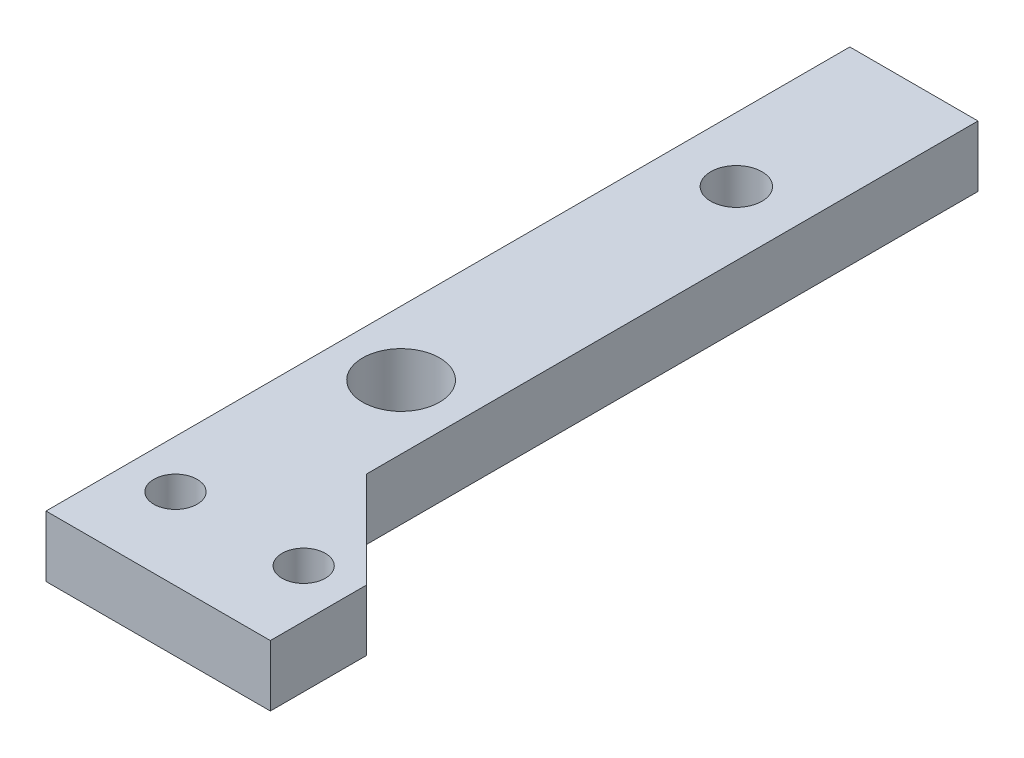
ISO-10303-21;
HEADER;
FILE_DESCRIPTION(('STEP AP214'),'2;1');
FILE_NAME('part.step','',(''),(''),'','','');
FILE_SCHEMA(('AUTOMOTIVE_DESIGN { 1 0 10303 214 1 1 1 1 }'));
ENDSEC;
DATA;
#1=APPLICATION_CONTEXT('core data for automotive mechanical design processes');
#2=APPLICATION_PROTOCOL_DEFINITION('international standard','automotive_design',2000,#1);
#3=PRODUCT_CONTEXT('',#1,'mechanical');
#4=PRODUCT('Part','Part','',(#3));
#5=PRODUCT_RELATED_PRODUCT_CATEGORY('part','',(#4));
#6=PRODUCT_DEFINITION_FORMATION('','',#4);
#7=PRODUCT_DEFINITION_CONTEXT('part definition',#1,'design');
#8=PRODUCT_DEFINITION('design','',#6,#7);
#9=PRODUCT_DEFINITION_SHAPE('','',#8);
#10=(LENGTH_UNIT() NAMED_UNIT(*) SI_UNIT(.MILLI.,.METRE.));
#11=(NAMED_UNIT(*) PLANE_ANGLE_UNIT() SI_UNIT($,.RADIAN.));
#12=(NAMED_UNIT(*) SI_UNIT($,.STERADIAN.) SOLID_ANGLE_UNIT());
#13=UNCERTAINTY_MEASURE_WITH_UNIT(LENGTH_MEASURE(1.E-05),#10,'distance_accuracy_value','');
#14=(GEOMETRIC_REPRESENTATION_CONTEXT(3) GLOBAL_UNCERTAINTY_ASSIGNED_CONTEXT((#13)) GLOBAL_UNIT_ASSIGNED_CONTEXT((#10,
#11,#12)) REPRESENTATION_CONTEXT('',''));
#15=CARTESIAN_POINT('',(0.,0.,0.));
#16=DIRECTION('',(0.,0.,1.));
#17=DIRECTION('',(1.,0.,0.));
#18=AXIS2_PLACEMENT_3D('',#15,#16,#17);
#19=CARTESIAN_POINT('',(20.,9.525,0.));
#20=DIRECTION('',(-1.,0.,0.));
#21=DIRECTION('',(0.,0.,1.));
#22=AXIS2_PLACEMENT_3D('',#19,#20,#21);
#23=PLANE('',#22);
#24=DIRECTION('',(0.,1.,0.));
#25=VECTOR('',#24,1.);
#26=CARTESIAN_POINT('',(20.,-33.541019662497,95.3999999999999));
#27=LINE('',#26,#25);
#28=CARTESIAN_POINT('',(20.,0.,95.3999999999999));
#29=VERTEX_POINT('',#28);
#30=CARTESIAN_POINT('',(20.,9.525,95.3999999999999));
#31=VERTEX_POINT('',#30);
#32=EDGE_CURVE('E60',#29,#31,#27,.T.);
#33=ORIENTED_EDGE('',*,*,#32,.F.);
#34=DIRECTION('',(0.,0.,-1.));
#35=VECTOR('',#34,1.);
#36=CARTESIAN_POINT('',(20.,0.,0.));
#37=LINE('',#36,#35);
#38=CARTESIAN_POINT('',(20.,0.,0.));
#39=VERTEX_POINT('',#38);
#40=EDGE_CURVE('E88',#29,#39,#37,.T.);
#41=ORIENTED_EDGE('',*,*,#40,.T.);
#42=DIRECTION('',(0.,-1.,0.));
#43=VECTOR('',#42,1.);
#44=CARTESIAN_POINT('',(20.,9.525,0.));
#45=LINE('',#44,#43);
#46=CARTESIAN_POINT('',(20.,9.525,0.));
#47=VERTEX_POINT('',#46);
#48=EDGE_CURVE('E11',#47,#39,#45,.T.);
#49=ORIENTED_EDGE('',*,*,#48,.F.);
#50=DIRECTION('',(0.,0.,-1.));
#51=VECTOR('',#50,1.);
#52=CARTESIAN_POINT('',(20.,9.525,0.));
#53=LINE('',#52,#51);
#54=EDGE_CURVE('E109',#31,#47,#53,.T.);
#55=ORIENTED_EDGE('',*,*,#54,.F.);
#56=EDGE_LOOP('',(#33,#41,#49,#55));
#57=FACE_BOUND('',#56,.T.);
#58=ADVANCED_FACE('F45',(#57),#23,.F.);
#59=CARTESIAN_POINT('',(0.,9.525,0.));
#60=DIRECTION('',(0.,1.,0.));
#61=DIRECTION('',(0.,0.,1.));
#62=AXIS2_PLACEMENT_3D('',#59,#60,#61);
#63=PLANE('',#62);
#64=CARTESIAN_POINT('',(7.5,9.525,112.7));
#65=DIRECTION('',(0.,1.,0.));
#66=DIRECTION('',(0.,0.,1.));
#67=AXIS2_PLACEMENT_3D('',#64,#65,#66);
#68=CIRCLE('',#67,3.37819999999999);
#69=CARTESIAN_POINT('',(7.5,9.525,116.0782));
#70=VERTEX_POINT('',#69);
#71=EDGE_CURVE('E153',#70,#70,#68,.T.);
#72=ORIENTED_EDGE('',*,*,#71,.F.);
#73=EDGE_LOOP('',(#72));
#74=FACE_BOUND('',#73,.T.);
#75=CARTESIAN_POINT('',(27.5,9.525,112.7));
#76=DIRECTION('',(0.,1.,0.));
#77=DIRECTION('',(0.,0.,1.));
#78=AXIS2_PLACEMENT_3D('',#75,#76,#77);
#79=CIRCLE('',#78,3.37819999999999);
#80=CARTESIAN_POINT('',(27.5,9.525,116.0782));
#81=VERTEX_POINT('',#80);
#82=EDGE_CURVE('E147',#81,#81,#79,.T.);
#83=ORIENTED_EDGE('',*,*,#82,.F.);
#84=EDGE_LOOP('',(#83));
#85=FACE_BOUND('',#84,.T.);
#86=CARTESIAN_POINT('',(10.,9.525,80.));
#87=DIRECTION('',(0.,1.,0.));
#88=DIRECTION('',(0.,0.,1.));
#89=AXIS2_PLACEMENT_3D('',#86,#87,#88);
#90=CIRCLE('',#89,6.00000000000001);
#91=CARTESIAN_POINT('',(10.,9.525,74.));
#92=VERTEX_POINT('',#91);
#93=EDGE_CURVE('E101',#92,#92,#90,.T.);
#94=ORIENTED_EDGE('',*,*,#93,.F.);
#95=EDGE_LOOP('',(#94));
#96=FACE_BOUND('',#95,.T.);
#97=DIRECTION('',(0.,0.,1.));
#98=VECTOR('',#97,1.);
#99=CARTESIAN_POINT('',(0.,9.525,0.));
#100=LINE('',#99,#98);
#101=CARTESIAN_POINT('',(0.,9.525,0.));
#102=VERTEX_POINT('',#101);
#103=CARTESIAN_POINT('',(0.,9.525,125.4));
#104=VERTEX_POINT('',#103);
#105=EDGE_CURVE('E87',#102,#104,#100,.T.);
#106=ORIENTED_EDGE('',*,*,#105,.T.);
#107=DIRECTION('',(1.,0.,0.));
#108=VECTOR('',#107,1.);
#109=CARTESIAN_POINT('',(0.,9.525,125.4));
#110=LINE('',#109,#108);
#111=CARTESIAN_POINT('',(35.,9.525,125.4));
#112=VERTEX_POINT('',#111);
#113=EDGE_CURVE('E123',#104,#112,#110,.T.);
#114=ORIENTED_EDGE('',*,*,#113,.T.);
#115=DIRECTION('',(0.,0.,-1.));
#116=VECTOR('',#115,1.);
#117=CARTESIAN_POINT('',(35.,9.525,125.4));
#118=LINE('',#117,#116);
#119=CARTESIAN_POINT('',(35.,9.525,110.4));
#120=VERTEX_POINT('',#119);
#121=EDGE_CURVE('E138',#112,#120,#118,.T.);
#122=ORIENTED_EDGE('',*,*,#121,.T.);
#123=DIRECTION('',(-0.707106781186544,0.,-0.707106781186551));
#124=VECTOR('',#123,1.);
#125=CARTESIAN_POINT('',(35.,9.525,110.4));
#126=LINE('',#125,#124);
#127=EDGE_CURVE('E131',#120,#31,#126,.T.);
#128=ORIENTED_EDGE('',*,*,#127,.T.);
#129=ORIENTED_EDGE('',*,*,#54,.T.);
#130=DIRECTION('',(-1.,0.,0.));
#131=VECTOR('',#130,1.);
#132=CARTESIAN_POINT('',(0.,9.525,0.));
#133=LINE('',#132,#131);
#134=EDGE_CURVE('E69',#47,#102,#133,.T.);
#135=ORIENTED_EDGE('',*,*,#134,.T.);
#136=EDGE_LOOP('',(#106,#114,#122,#128,#129,#135));
#137=FACE_BOUND('',#136,.T.);
#138=CARTESIAN_POINT('',(10.,9.525,27.7));
#139=DIRECTION('',(0.,1.,0.));
#140=DIRECTION('',(0.,0.,1.));
#141=AXIS2_PLACEMENT_3D('',#138,#139,#140);
#142=CIRCLE('',#141,4.);
#143=CARTESIAN_POINT('',(10.,9.525,23.7));
#144=VERTEX_POINT('',#143);
#145=EDGE_CURVE('E113',#144,#144,#142,.T.);
#146=ORIENTED_EDGE('',*,*,#145,.F.);
#147=EDGE_LOOP('',(#146));
#148=FACE_BOUND('',#147,.T.);
#149=ADVANCED_FACE('F159',(#74,#85,#96,#137,#148),#63,.T.);
#150=CARTESIAN_POINT('',(0.,0.,0.));
#151=DIRECTION('',(0.,1.,0.));
#152=DIRECTION('',(0.,0.,1.));
#153=AXIS2_PLACEMENT_3D('',#150,#151,#152);
#154=PLANE('',#153);
#155=CARTESIAN_POINT('',(7.5,0.,112.7));
#156=DIRECTION('',(0.,1.,0.));
#157=DIRECTION('',(0.,0.,1.));
#158=AXIS2_PLACEMENT_3D('',#155,#156,#157);
#159=CIRCLE('',#158,3.3782);
#160=CARTESIAN_POINT('',(7.5,0.,116.0782));
#161=VERTEX_POINT('',#160);
#162=EDGE_CURVE('E150',#161,#161,#159,.T.);
#163=ORIENTED_EDGE('',*,*,#162,.T.);
#164=EDGE_LOOP('',(#163));
#165=FACE_BOUND('',#164,.T.);
#166=CARTESIAN_POINT('',(27.5,0.,112.7));
#167=DIRECTION('',(0.,1.,0.));
#168=DIRECTION('',(0.,0.,1.));
#169=AXIS2_PLACEMENT_3D('',#166,#167,#168);
#170=CIRCLE('',#169,3.3782);
#171=CARTESIAN_POINT('',(27.5,0.,116.0782));
#172=VERTEX_POINT('',#171);
#173=EDGE_CURVE('E141',#172,#172,#170,.T.);
#174=ORIENTED_EDGE('',*,*,#173,.T.);
#175=EDGE_LOOP('',(#174));
#176=FACE_BOUND('',#175,.T.);
#177=DIRECTION('',(0.,0.,1.));
#178=VECTOR('',#177,1.);
#179=CARTESIAN_POINT('',(0.,0.,0.));
#180=LINE('',#179,#178);
#181=CARTESIAN_POINT('',(0.,0.,0.));
#182=VERTEX_POINT('',#181);
#183=CARTESIAN_POINT('',(0.,0.,125.4));
#184=VERTEX_POINT('',#183);
#185=EDGE_CURVE('E93',#182,#184,#180,.T.);
#186=ORIENTED_EDGE('',*,*,#185,.F.);
#187=DIRECTION('',(-1.,0.,0.));
#188=VECTOR('',#187,1.);
#189=CARTESIAN_POINT('',(0.,0.,0.));
#190=LINE('',#189,#188);
#191=EDGE_CURVE('E80',#39,#182,#190,.T.);
#192=ORIENTED_EDGE('',*,*,#191,.F.);
#193=ORIENTED_EDGE('',*,*,#40,.F.);
#194=DIRECTION('',(0.707106781186544,0.,0.707106781186551));
#195=VECTOR('',#194,1.);
#196=CARTESIAN_POINT('',(35.,0.,110.4));
#197=LINE('',#196,#195);
#198=CARTESIAN_POINT('',(35.,0.,110.4));
#199=VERTEX_POINT('',#198);
#200=EDGE_CURVE('E126',#29,#199,#197,.T.);
#201=ORIENTED_EDGE('',*,*,#200,.T.);
#202=DIRECTION('',(0.,0.,1.));
#203=VECTOR('',#202,1.);
#204=CARTESIAN_POINT('',(35.,0.,125.4));
#205=LINE('',#204,#203);
#206=CARTESIAN_POINT('',(35.,0.,125.4));
#207=VERTEX_POINT('',#206);
#208=EDGE_CURVE('E135',#199,#207,#205,.T.);
#209=ORIENTED_EDGE('',*,*,#208,.T.);
#210=DIRECTION('',(-1.,0.,0.));
#211=VECTOR('',#210,1.);
#212=CARTESIAN_POINT('',(0.,0.,125.4));
#213=LINE('',#212,#211);
#214=EDGE_CURVE('E99',#207,#184,#213,.T.);
#215=ORIENTED_EDGE('',*,*,#214,.T.);
#216=EDGE_LOOP('',(#186,#192,#193,#201,#209,#215));
#217=FACE_BOUND('',#216,.T.);
#218=CARTESIAN_POINT('',(10.,0.,80.));
#219=DIRECTION('',(0.,1.,0.));
#220=DIRECTION('',(0.,0.,1.));
#221=AXIS2_PLACEMENT_3D('',#218,#219,#220);
#222=CIRCLE('',#221,6.00000000000001);
#223=CARTESIAN_POINT('',(10.,0.,74.));
#224=VERTEX_POINT('',#223);
#225=EDGE_CURVE('E105',#224,#224,#222,.T.);
#226=ORIENTED_EDGE('',*,*,#225,.T.);
#227=EDGE_LOOP('',(#226));
#228=FACE_BOUND('',#227,.T.);
#229=CARTESIAN_POINT('',(10.,0.,27.7));
#230=DIRECTION('',(0.,1.,0.));
#231=DIRECTION('',(0.,0.,1.));
#232=AXIS2_PLACEMENT_3D('',#229,#230,#231);
#233=CIRCLE('',#232,4.);
#234=CARTESIAN_POINT('',(10.,0.,23.7));
#235=VERTEX_POINT('',#234);
#236=EDGE_CURVE('E115',#235,#235,#233,.T.);
#237=ORIENTED_EDGE('',*,*,#236,.T.);
#238=EDGE_LOOP('',(#237));
#239=FACE_BOUND('',#238,.T.);
#240=ADVANCED_FACE('F95',(#165,#176,#217,#228,#239),#154,.F.);
#241=CARTESIAN_POINT('',(0.,9.525,0.));
#242=DIRECTION('',(1.,0.,0.));
#243=DIRECTION('',(0.,0.,-1.));
#244=AXIS2_PLACEMENT_3D('',#241,#242,#243);
#245=PLANE('',#244);
#246=ORIENTED_EDGE('',*,*,#185,.T.);
#247=DIRECTION('',(0.,1.,0.));
#248=VECTOR('',#247,1.);
#249=CARTESIAN_POINT('',(0.,-32.3289344086687,125.4));
#250=LINE('',#249,#248);
#251=EDGE_CURVE('E121',#184,#104,#250,.T.);
#252=ORIENTED_EDGE('',*,*,#251,.T.);
#253=ORIENTED_EDGE('',*,*,#105,.F.);
#254=DIRECTION('',(0.,-1.,0.));
#255=VECTOR('',#254,1.);
#256=CARTESIAN_POINT('',(0.,9.525,0.));
#257=LINE('',#256,#255);
#258=EDGE_CURVE('E53',#102,#182,#257,.T.);
#259=ORIENTED_EDGE('',*,*,#258,.T.);
#260=EDGE_LOOP('',(#246,#252,#253,#259));
#261=FACE_BOUND('',#260,.T.);
#262=ADVANCED_FACE('F47',(#261),#245,.F.);
#263=CARTESIAN_POINT('',(0.,9.525,0.));
#264=DIRECTION('',(0.,0.,1.));
#265=DIRECTION('',(1.,0.,0.));
#266=AXIS2_PLACEMENT_3D('',#263,#264,#265);
#267=PLANE('',#266);
#268=ORIENTED_EDGE('',*,*,#191,.T.);
#269=ORIENTED_EDGE('',*,*,#258,.F.);
#270=ORIENTED_EDGE('',*,*,#134,.F.);
#271=ORIENTED_EDGE('',*,*,#48,.T.);
#272=EDGE_LOOP('',(#268,#269,#270,#271));
#273=FACE_BOUND('',#272,.T.);
#274=ADVANCED_FACE('F82',(#273),#267,.F.);
#275=CARTESIAN_POINT('',(10.,9.525,80.));
#276=DIRECTION('',(0.,-1.,0.));
#277=DIRECTION('',(0.,0.,-1.));
#278=AXIS2_PLACEMENT_3D('',#275,#276,#277);
#279=CYLINDRICAL_SURFACE('',#278,6.00000000000001);
#280=CARTESIAN_POINT('',(10.,9.525,74.));
#281=CARTESIAN_POINT('',(10.,9.42578125,74.));
#282=CARTESIAN_POINT('',(10.,9.3265625,74.));
#283=CARTESIAN_POINT('',(10.,9.128125,74.));
#284=CARTESIAN_POINT('',(10.,9.02890625,74.));
#285=CARTESIAN_POINT('',(10.,8.83046875,74.));
#286=CARTESIAN_POINT('',(10.,8.73125,74.));
#287=CARTESIAN_POINT('',(10.,8.5328125,74.));
#288=CARTESIAN_POINT('',(10.,8.43359375,74.));
#289=CARTESIAN_POINT('',(10.,8.23515625,74.));
#290=CARTESIAN_POINT('',(10.,8.1359375,74.));
#291=CARTESIAN_POINT('',(10.,7.9375,74.));
#292=CARTESIAN_POINT('',(10.,7.83828125,74.));
#293=CARTESIAN_POINT('',(10.,7.63984375,74.));
#294=CARTESIAN_POINT('',(10.,7.540625,74.));
#295=CARTESIAN_POINT('',(10.,7.3421875,74.));
#296=CARTESIAN_POINT('',(10.,7.24296875,74.));
#297=CARTESIAN_POINT('',(10.,7.04453125,74.));
#298=CARTESIAN_POINT('',(10.,6.9453125,74.));
#299=CARTESIAN_POINT('',(10.,6.746875,74.));
#300=CARTESIAN_POINT('',(10.,6.64765625,74.));
#301=CARTESIAN_POINT('',(10.,6.44921875,74.));
#302=CARTESIAN_POINT('',(10.,6.35,74.));
#303=CARTESIAN_POINT('',(10.,6.1515625,74.));
#304=CARTESIAN_POINT('',(10.,6.05234375,74.));
#305=CARTESIAN_POINT('',(10.,5.85390625,74.));
#306=CARTESIAN_POINT('',(10.,5.7546875,74.));
#307=CARTESIAN_POINT('',(10.,5.55625,74.));
#308=CARTESIAN_POINT('',(10.,5.45703125,74.));
#309=CARTESIAN_POINT('',(10.,5.25859375,74.));
#310=CARTESIAN_POINT('',(10.,5.159375,74.));
#311=CARTESIAN_POINT('',(10.,4.9609375,74.));
#312=CARTESIAN_POINT('',(10.,4.86171875,74.));
#313=CARTESIAN_POINT('',(10.,4.66328125,74.));
#314=CARTESIAN_POINT('',(10.,4.5640625,74.));
#315=CARTESIAN_POINT('',(10.,4.365625,74.));
#316=CARTESIAN_POINT('',(10.,4.26640625,74.));
#317=CARTESIAN_POINT('',(10.,4.06796875,74.));
#318=CARTESIAN_POINT('',(10.,3.96875,74.));
#319=CARTESIAN_POINT('',(10.,3.7703125,74.));
#320=CARTESIAN_POINT('',(10.,3.67109375,74.));
#321=CARTESIAN_POINT('',(10.,3.47265625,74.));
#322=CARTESIAN_POINT('',(10.,3.3734375,74.));
#323=CARTESIAN_POINT('',(10.,3.175,74.));
#324=CARTESIAN_POINT('',(10.,3.07578125,74.));
#325=CARTESIAN_POINT('',(10.,2.87734375,74.));
#326=CARTESIAN_POINT('',(10.,2.778125,74.));
#327=CARTESIAN_POINT('',(10.,2.5796875,74.));
#328=CARTESIAN_POINT('',(10.,2.48046875,74.));
#329=CARTESIAN_POINT('',(10.,2.28203125,74.));
#330=CARTESIAN_POINT('',(10.,2.1828125,74.));
#331=CARTESIAN_POINT('',(10.,1.984375,74.));
#332=CARTESIAN_POINT('',(10.,1.88515625,74.));
#333=CARTESIAN_POINT('',(10.,1.68671875,74.));
#334=CARTESIAN_POINT('',(10.,1.5875,74.));
#335=CARTESIAN_POINT('',(10.,1.3890625,74.));
#336=CARTESIAN_POINT('',(10.,1.28984375,74.));
#337=CARTESIAN_POINT('',(10.,1.09140625,74.));
#338=CARTESIAN_POINT('',(10.,0.992187500000001,74.));
#339=CARTESIAN_POINT('',(10.,0.793750000000001,74.));
#340=CARTESIAN_POINT('',(10.,0.69453125,74.));
#341=CARTESIAN_POINT('',(10.,0.49609375,74.));
#342=CARTESIAN_POINT('',(10.,0.396875,74.));
#343=CARTESIAN_POINT('',(10.,0.1984375,74.));
#344=CARTESIAN_POINT('',(10.,0.0992187500000001,74.));
#345=CARTESIAN_POINT('',(10.,0.,74.));
#346=B_SPLINE_CURVE_WITH_KNOTS('',3,(#280,#281,#282,#283,#284,#285,#286,#287,#288,#289,#290,
#291,#292,#293,#294,#295,#296,#297,#298,#299,#300,#301,#302,#303,#304,#305,#306,#307,#308,#309,
#310,#311,#312,#313,#314,#315,#316,#317,#318,#319,#320,#321,#322,#323,#324,#325,#326,#327,#328,
#329,#330,#331,#332,#333,#334,#335,#336,#337,#338,#339,#340,#341,#342,#343,#344,#345),
.UNSPECIFIED.,.F.,.F.,(4,2,2,2,2,2,2,2,2,2,2,2,2,2,2,2,2,2,2,2,2,2,2,2,2,2,2,2,2,2,2,2,4),(0.,
0.29765625,0.5953125,0.892968750000001,1.190625,1.48828125,1.7859375,2.08359375,2.38125,
2.67890625,2.9765625,3.27421875,3.571875,3.86953125,4.1671875,4.46484375,4.7625,5.06015625,
5.3578125,5.65546875,5.953125,6.25078125,6.5484375,6.84609375,7.14375,7.44140625,7.7390625,
8.03671875,8.334375,8.63203125,8.9296875,9.22734375,9.525),.UNSPECIFIED.);
#347=EDGE_CURVE('BSEAM174',#92,#224,#346,.T.);
#348=ORIENTED_EDGE('',*,*,#93,.T.);
#349=ORIENTED_EDGE('',*,*,#225,.F.);
#350=ORIENTED_EDGE('',*,*,#347,.T.);
#351=ORIENTED_EDGE('',*,*,#347,.F.);
#352=EDGE_LOOP('',(#348,#350,#349,#351));
#353=FACE_BOUND('',#352,.T.);
#354=ADVANCED_FACE('F174',(#353),#279,.F.);
#355=CARTESIAN_POINT('',(10.,9.525,27.7));
#356=DIRECTION('',(0.,-1.,0.));
#357=DIRECTION('',(0.,0.,-1.));
#358=AXIS2_PLACEMENT_3D('',#355,#356,#357);
#359=CYLINDRICAL_SURFACE('',#358,4.);
#360=CARTESIAN_POINT('',(10.,9.525,23.7));
#361=CARTESIAN_POINT('',(10.,9.42578125,23.7));
#362=CARTESIAN_POINT('',(10.,9.3265625,23.7));
#363=CARTESIAN_POINT('',(10.,9.128125,23.7));
#364=CARTESIAN_POINT('',(10.,9.02890625,23.7));
#365=CARTESIAN_POINT('',(10.,8.83046875,23.7));
#366=CARTESIAN_POINT('',(10.,8.73125,23.7));
#367=CARTESIAN_POINT('',(10.,8.5328125,23.7));
#368=CARTESIAN_POINT('',(10.,8.43359375,23.7));
#369=CARTESIAN_POINT('',(10.,8.23515625,23.7));
#370=CARTESIAN_POINT('',(10.,8.1359375,23.7));
#371=CARTESIAN_POINT('',(10.,7.9375,23.7));
#372=CARTESIAN_POINT('',(10.,7.83828125,23.7));
#373=CARTESIAN_POINT('',(10.,7.63984375,23.7));
#374=CARTESIAN_POINT('',(10.,7.540625,23.7));
#375=CARTESIAN_POINT('',(10.,7.3421875,23.7));
#376=CARTESIAN_POINT('',(10.,7.24296875,23.7));
#377=CARTESIAN_POINT('',(10.,7.04453125,23.7));
#378=CARTESIAN_POINT('',(10.,6.9453125,23.7));
#379=CARTESIAN_POINT('',(10.,6.746875,23.7));
#380=CARTESIAN_POINT('',(10.,6.64765625,23.7));
#381=CARTESIAN_POINT('',(10.,6.44921875,23.7));
#382=CARTESIAN_POINT('',(10.,6.35,23.7));
#383=CARTESIAN_POINT('',(10.,6.1515625,23.7));
#384=CARTESIAN_POINT('',(10.,6.05234375,23.7));
#385=CARTESIAN_POINT('',(10.,5.85390625,23.7));
#386=CARTESIAN_POINT('',(10.,5.7546875,23.7));
#387=CARTESIAN_POINT('',(10.,5.55625,23.7));
#388=CARTESIAN_POINT('',(10.,5.45703125,23.7));
#389=CARTESIAN_POINT('',(10.,5.25859375,23.7));
#390=CARTESIAN_POINT('',(10.,5.159375,23.7));
#391=CARTESIAN_POINT('',(10.,4.9609375,23.7));
#392=CARTESIAN_POINT('',(10.,4.86171875,23.7));
#393=CARTESIAN_POINT('',(10.,4.66328125,23.7));
#394=CARTESIAN_POINT('',(10.,4.5640625,23.7));
#395=CARTESIAN_POINT('',(10.,4.365625,23.7));
#396=CARTESIAN_POINT('',(10.,4.26640625,23.7));
#397=CARTESIAN_POINT('',(10.,4.06796875,23.7));
#398=CARTESIAN_POINT('',(10.,3.96875,23.7));
#399=CARTESIAN_POINT('',(10.,3.7703125,23.7));
#400=CARTESIAN_POINT('',(10.,3.67109375,23.7));
#401=CARTESIAN_POINT('',(10.,3.47265625,23.7));
#402=CARTESIAN_POINT('',(10.,3.3734375,23.7));
#403=CARTESIAN_POINT('',(10.,3.175,23.7));
#404=CARTESIAN_POINT('',(10.,3.07578125,23.7));
#405=CARTESIAN_POINT('',(10.,2.87734375,23.7));
#406=CARTESIAN_POINT('',(10.,2.778125,23.7));
#407=CARTESIAN_POINT('',(10.,2.5796875,23.7));
#408=CARTESIAN_POINT('',(10.,2.48046875,23.7));
#409=CARTESIAN_POINT('',(10.,2.28203125,23.7));
#410=CARTESIAN_POINT('',(10.,2.1828125,23.7));
#411=CARTESIAN_POINT('',(10.,1.984375,23.7));
#412=CARTESIAN_POINT('',(10.,1.88515625,23.7));
#413=CARTESIAN_POINT('',(10.,1.68671875,23.7));
#414=CARTESIAN_POINT('',(10.,1.5875,23.7));
#415=CARTESIAN_POINT('',(10.,1.3890625,23.7));
#416=CARTESIAN_POINT('',(10.,1.28984375,23.7));
#417=CARTESIAN_POINT('',(10.,1.09140625,23.7));
#418=CARTESIAN_POINT('',(10.,0.992187500000001,23.7));
#419=CARTESIAN_POINT('',(10.,0.793750000000001,23.7));
#420=CARTESIAN_POINT('',(10.,0.69453125,23.7));
#421=CARTESIAN_POINT('',(10.,0.49609375,23.7));
#422=CARTESIAN_POINT('',(10.,0.396875,23.7));
#423=CARTESIAN_POINT('',(10.,0.1984375,23.7));
#424=CARTESIAN_POINT('',(10.,0.0992187500000001,23.7));
#425=CARTESIAN_POINT('',(10.,0.,23.7));
#426=B_SPLINE_CURVE_WITH_KNOTS('',3,(#360,#361,#362,#363,#364,#365,#366,#367,#368,#369,#370,
#371,#372,#373,#374,#375,#376,#377,#378,#379,#380,#381,#382,#383,#384,#385,#386,#387,#388,#389,
#390,#391,#392,#393,#394,#395,#396,#397,#398,#399,#400,#401,#402,#403,#404,#405,#406,#407,#408,
#409,#410,#411,#412,#413,#414,#415,#416,#417,#418,#419,#420,#421,#422,#423,#424,#425),
.UNSPECIFIED.,.F.,.F.,(4,2,2,2,2,2,2,2,2,2,2,2,2,2,2,2,2,2,2,2,2,2,2,2,2,2,2,2,2,2,2,2,4),(0.,
0.297656249999998,0.595312499999999,0.892968749999999,1.190625,1.48828125,1.7859375,2.08359375,
2.38125,2.67890625,2.9765625,3.27421875,3.571875,3.86953125,4.1671875,4.46484375,4.7625,
5.06015625,5.3578125,5.65546875,5.953125,6.25078125,6.5484375,6.84609375,7.14375,7.44140625,
7.7390625,8.03671875,8.334375,8.63203125,8.9296875,9.22734375,9.525),.UNSPECIFIED.);
#427=EDGE_CURVE('BSEAM170',#144,#235,#426,.T.);
#428=ORIENTED_EDGE('',*,*,#145,.T.);
#429=ORIENTED_EDGE('',*,*,#236,.F.);
#430=ORIENTED_EDGE('',*,*,#427,.T.);
#431=ORIENTED_EDGE('',*,*,#427,.F.);
#432=EDGE_LOOP('',(#428,#430,#429,#431));
#433=FACE_BOUND('',#432,.T.);
#434=ADVANCED_FACE('F170',(#433),#359,.F.);
#435=CARTESIAN_POINT('',(0.,-32.3289344086687,125.4));
#436=DIRECTION('',(0.,0.,1.));
#437=DIRECTION('',(1.,0.,0.));
#438=AXIS2_PLACEMENT_3D('',#435,#436,#437);
#439=PLANE('',#438);
#440=ORIENTED_EDGE('',*,*,#214,.F.);
#441=DIRECTION('',(0.,1.,0.));
#442=VECTOR('',#441,1.);
#443=CARTESIAN_POINT('',(35.,-33.541019662497,125.4));
#444=LINE('',#443,#442);
#445=EDGE_CURVE('E127',#207,#112,#444,.T.);
#446=ORIENTED_EDGE('',*,*,#445,.T.);
#447=ORIENTED_EDGE('',*,*,#113,.F.);
#448=ORIENTED_EDGE('',*,*,#251,.F.);
#449=EDGE_LOOP('',(#440,#446,#447,#448));
#450=FACE_BOUND('',#449,.T.);
#451=ADVANCED_FACE('F173',(#450),#439,.T.);
#452=CARTESIAN_POINT('',(35.,-33.541019662497,110.4));
#453=DIRECTION('',(0.707106781186551,0.,-0.707106781186544));
#454=DIRECTION('',(-0.707106781186544,0.,-0.707106781186551));
#455=AXIS2_PLACEMENT_3D('',#452,#453,#454);
#456=PLANE('',#455);
#457=ORIENTED_EDGE('',*,*,#200,.F.);
#458=ORIENTED_EDGE('',*,*,#32,.T.);
#459=ORIENTED_EDGE('',*,*,#127,.F.);
#460=DIRECTION('',(0.,1.,0.));
#461=VECTOR('',#460,1.);
#462=CARTESIAN_POINT('',(35.,-33.541019662497,110.4));
#463=LINE('',#462,#461);
#464=EDGE_CURVE('E130',#199,#120,#463,.T.);
#465=ORIENTED_EDGE('',*,*,#464,.F.);
#466=EDGE_LOOP('',(#457,#458,#459,#465));
#467=FACE_BOUND('',#466,.T.);
#468=ADVANCED_FACE('F202',(#467),#456,.T.);
#469=CARTESIAN_POINT('',(35.,-33.541019662497,125.4));
#470=DIRECTION('',(1.,0.,0.));
#471=DIRECTION('',(0.,0.,-1.));
#472=AXIS2_PLACEMENT_3D('',#469,#470,#471);
#473=PLANE('',#472);
#474=ORIENTED_EDGE('',*,*,#208,.F.);
#475=ORIENTED_EDGE('',*,*,#464,.T.);
#476=ORIENTED_EDGE('',*,*,#121,.F.);
#477=ORIENTED_EDGE('',*,*,#445,.F.);
#478=EDGE_LOOP('',(#474,#475,#476,#477));
#479=FACE_BOUND('',#478,.T.);
#480=ADVANCED_FACE('F204',(#479),#473,.T.);
#481=CARTESIAN_POINT('',(27.5,9.525,112.7));
#482=DIRECTION('',(0.,1.,0.));
#483=DIRECTION('',(0.,0.,1.));
#484=AXIS2_PLACEMENT_3D('',#481,#482,#483);
#485=CYLINDRICAL_SURFACE('',#484,3.37819999999999);
#486=ORIENTED_EDGE('',*,*,#173,.F.);
#487=EDGE_LOOP('',(#486));
#488=FACE_BOUND('',#487,.T.);
#489=ORIENTED_EDGE('',*,*,#82,.T.);
#490=EDGE_LOOP('',(#489));
#491=FACE_BOUND('',#490,.T.);
#492=ADVANCED_FACE('F207',(#488,#491),#485,.F.);
#493=CARTESIAN_POINT('',(7.5,9.525,112.7));
#494=DIRECTION('',(0.,1.,0.));
#495=DIRECTION('',(0.,0.,1.));
#496=AXIS2_PLACEMENT_3D('',#493,#494,#495);
#497=CYLINDRICAL_SURFACE('',#496,3.37819999999999);
#498=ORIENTED_EDGE('',*,*,#162,.F.);
#499=EDGE_LOOP('',(#498));
#500=FACE_BOUND('',#499,.T.);
#501=ORIENTED_EDGE('',*,*,#71,.T.);
#502=EDGE_LOOP('',(#501));
#503=FACE_BOUND('',#502,.T.);
#504=ADVANCED_FACE('F157',(#500,#503),#497,.F.);
#505=CLOSED_SHELL('',(#58,#149,#240,#262,#274,#354,#434,#451,#468,#480,#492,#504));
#506=MANIFOLD_SOLID_BREP('B2',#505);
#507=ADVANCED_BREP_SHAPE_REPRESENTATION('',(#18,#506),#14);
#508=SHAPE_DEFINITION_REPRESENTATION(#9,#507);
ENDSEC;
END-ISO-10303-21;
